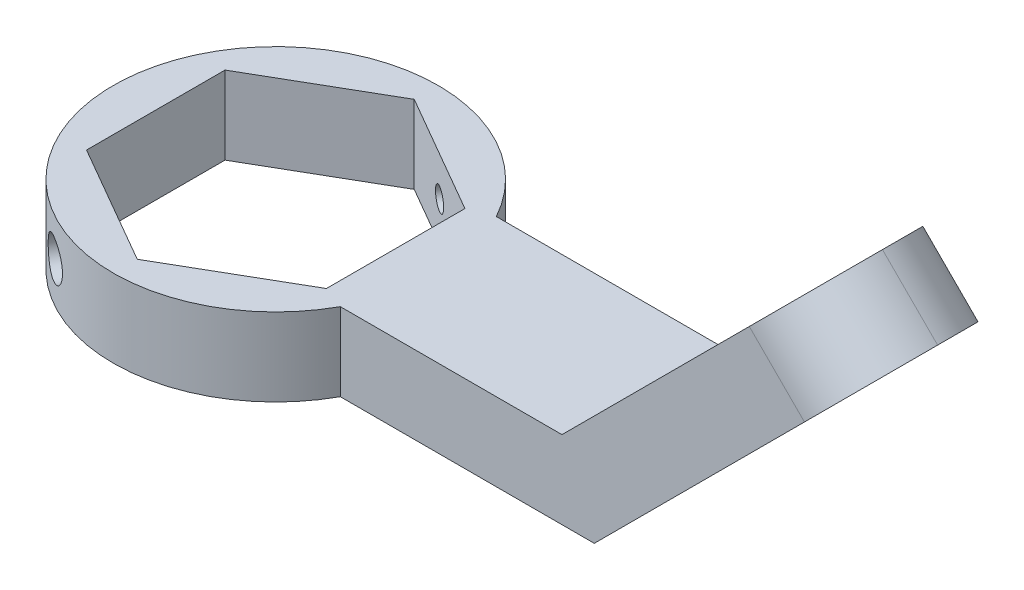
ISO-10303-21;
HEADER;
FILE_DESCRIPTION(('STEP AP214'),'2;1');
FILE_NAME('part.step','',(''),(''),'','','');
FILE_SCHEMA(('AUTOMOTIVE_DESIGN { 1 0 10303 214 1 1 1 1 }'));
ENDSEC;
DATA;
#1=APPLICATION_CONTEXT('core data for automotive mechanical design processes');
#2=APPLICATION_PROTOCOL_DEFINITION('international standard','automotive_design',2000,#1);
#3=PRODUCT_CONTEXT('',#1,'mechanical');
#4=PRODUCT('Part','Part','',(#3));
#5=PRODUCT_RELATED_PRODUCT_CATEGORY('part','',(#4));
#6=PRODUCT_DEFINITION_FORMATION('','',#4);
#7=PRODUCT_DEFINITION_CONTEXT('part definition',#1,'design');
#8=PRODUCT_DEFINITION('design','',#6,#7);
#9=PRODUCT_DEFINITION_SHAPE('','',#8);
#10=(LENGTH_UNIT() NAMED_UNIT(*) SI_UNIT(.MILLI.,.METRE.));
#11=(NAMED_UNIT(*) PLANE_ANGLE_UNIT() SI_UNIT($,.RADIAN.));
#12=(NAMED_UNIT(*) SI_UNIT($,.STERADIAN.) SOLID_ANGLE_UNIT());
#13=UNCERTAINTY_MEASURE_WITH_UNIT(LENGTH_MEASURE(1.E-05),#10,'distance_accuracy_value','');
#14=(GEOMETRIC_REPRESENTATION_CONTEXT(3) GLOBAL_UNCERTAINTY_ASSIGNED_CONTEXT((#13)) GLOBAL_UNIT_ASSIGNED_CONTEXT((#10,
#11,#12)) REPRESENTATION_CONTEXT('',''));
#15=CARTESIAN_POINT('',(0.,0.,0.));
#16=DIRECTION('',(0.,0.,1.));
#17=DIRECTION('',(1.,0.,0.));
#18=AXIS2_PLACEMENT_3D('',#15,#16,#17);
#19=CARTESIAN_POINT('',(0.,12.,0.));
#20=DIRECTION('',(0.,-1.,0.));
#21=DIRECTION('',(0.,0.,-1.));
#22=AXIS2_PLACEMENT_3D('',#19,#20,#21);
#23=CYLINDRICAL_SURFACE('',#22,25.);
#24=CARTESIAN_POINT('',(0.,0.,0.));
#25=DIRECTION('',(0.,1.,0.));
#26=DIRECTION('',(0.,0.,1.));
#27=AXIS2_PLACEMENT_3D('',#24,#25,#26);
#28=CIRCLE('',#27,25.);
#29=CARTESIAN_POINT('',(21.9317121994613,0.,-12.));
#30=VERTEX_POINT('',#29);
#31=CARTESIAN_POINT('',(21.9317121994613,0.,12.));
#32=VERTEX_POINT('',#31);
#33=EDGE_CURVE('E183',#30,#32,#28,.T.);
#34=ORIENTED_EDGE('',*,*,#33,.T.);
#35=DIRECTION('',(0.,-1.,0.));
#36=VECTOR('',#35,1.);
#37=CARTESIAN_POINT('',(21.9317121994613,12.,12.));
#38=LINE('',#37,#36);
#39=CARTESIAN_POINT('',(21.9317121994613,12.,12.));
#40=VERTEX_POINT('',#39);
#41=EDGE_CURVE('E237',#40,#32,#38,.T.);
#42=ORIENTED_EDGE('',*,*,#41,.F.);
#43=CARTESIAN_POINT('',(0.,12.,0.));
#44=DIRECTION('',(0.,1.,0.));
#45=DIRECTION('',(0.,0.,1.));
#46=AXIS2_PLACEMENT_3D('',#43,#44,#45);
#47=CIRCLE('',#46,25.);
#48=CARTESIAN_POINT('',(21.9317121994613,12.,-12.));
#49=VERTEX_POINT('',#48);
#50=EDGE_CURVE('E232',#49,#40,#47,.T.);
#51=ORIENTED_EDGE('',*,*,#50,.F.);
#52=DIRECTION('',(0.,-1.,0.));
#53=VECTOR('',#52,1.);
#54=CARTESIAN_POINT('',(21.9317121994613,12.,-12.));
#55=LINE('',#54,#53);
#56=EDGE_CURVE('E253',#49,#30,#55,.T.);
#57=ORIENTED_EDGE('',*,*,#56,.T.);
#58=EDGE_LOOP('',(#34,#42,#51,#57));
#59=FACE_BOUND('',#58,.T.);
#60=CARTESIAN_POINT('',(15.0077498573442,6.,-19.9941852602047));
#61=CARTESIAN_POINT('',(15.0077448122229,6.16785914119987,-19.9941908583441));
#62=CARTESIAN_POINT('',(14.9963684818543,6.33582452014984,-20.0027438696797));
#63=CARTESIAN_POINT('',(14.9510929308831,6.66708461205788,-20.0366062107909));
#64=CARTESIAN_POINT('',(14.9171698949131,6.83037419568626,-20.0619332583471));
#65=CARTESIAN_POINT('',(14.8276012887336,7.14743840550452,-20.1282220941398));
#66=CARTESIAN_POINT('',(14.77197011862,7.30121926113373,-20.1691735175431));
#67=CARTESIAN_POINT('',(14.6402729954507,7.59504714210346,-20.2649699136414));
#68=CARTESIAN_POINT('',(14.5642106581854,7.73509659156863,-20.3198124278732));
#69=CARTESIAN_POINT('',(14.3929912745472,7.9982397716095,-20.4414492818103));
#70=CARTESIAN_POINT('',(14.2977477518982,8.12125229434842,-20.5082975950783));
#71=CARTESIAN_POINT('',(14.0906106869445,8.34612871816209,-20.6511618907633));
#72=CARTESIAN_POINT('',(13.9787163315991,8.44799158594184,-20.7271783208143));
#73=CARTESIAN_POINT('',(13.7406151164317,8.62796653293622,-20.8857843719726));
#74=CARTESIAN_POINT('',(13.6143657512348,8.70600541573962,-20.9683932862663));
#75=CARTESIAN_POINT('',(13.3510419235556,8.83564846038475,-21.1370314110348));
#76=CARTESIAN_POINT('',(13.2139678328924,8.88725352974773,-21.2230605039794));
#77=CARTESIAN_POINT('',(12.9333396281705,8.96232225610345,-21.3952256335651));
#78=CARTESIAN_POINT('',(12.7898200164027,8.98592065344577,-21.4813591459841));
#79=CARTESIAN_POINT('',(12.4996812665472,9.00472359931052,-21.6514720254139));
#80=CARTESIAN_POINT('',(12.3530622415624,8.99992918215822,-21.7354514707834));
#81=CARTESIAN_POINT('',(12.0617107677518,8.96219087814864,-21.8984672109817));
#82=CARTESIAN_POINT('',(11.9169724943475,8.92939189502761,-21.9775267077472));
#83=CARTESIAN_POINT('',(11.6328643804115,8.83680184828401,-22.1292208846134));
#84=CARTESIAN_POINT('',(11.493494635164,8.77701030581835,-22.2018554507096));
#85=CARTESIAN_POINT('',(11.2239597214492,8.63197727109348,-22.3393307461755));
#86=CARTESIAN_POINT('',(11.0938183424583,8.54667276399358,-22.4041516136281));
#87=CARTESIAN_POINT('',(10.8470961575383,8.35308110104385,-22.524639499839));
#88=CARTESIAN_POINT('',(10.7305159252157,8.24479297358439,-22.5803061314344));
#89=CARTESIAN_POINT('',(10.5138724366611,8.00749565045954,-22.681995667056));
#90=CARTESIAN_POINT('',(10.413917856451,7.8783602186265,-22.7279556107894));
#91=CARTESIAN_POINT('',(10.2346680426288,7.6034684863205,-22.8092368849377));
#92=CARTESIAN_POINT('',(10.1553728649674,7.45771214083552,-22.8445581865404));
#93=CARTESIAN_POINT('',(10.0200722259647,7.15360750985263,-22.9042277580537));
#94=CARTESIAN_POINT('',(9.96407544232853,6.9952545587421,-22.9285719397152));
#95=CARTESIAN_POINT('',(9.87735658101705,6.67050764049883,-22.9660636434439));
#96=CARTESIAN_POINT('',(9.84663338382343,6.50411402988071,-22.9792116614571));
#97=CARTESIAN_POINT('',(9.81165736832351,6.16911690362332,-22.9941676426372));
#98=CARTESIAN_POINT('',(9.80724113542349,6.00053356411887,-22.9960456140484));
#99=CARTESIAN_POINT('',(9.82459827105967,5.66497121915707,-22.9886353305408));
#100=CARTESIAN_POINT('',(9.84637112616817,5.49799218231263,-22.9793472945274));
#101=CARTESIAN_POINT('',(9.91523042894637,5.17090421640203,-22.9497187105284));
#102=CARTESIAN_POINT('',(9.9622384504026,5.01077565319068,-22.9294124031923));
#103=CARTESIAN_POINT('',(10.0799047358108,4.70132071702404,-22.8779286737309));
#104=CARTESIAN_POINT('',(10.1505637687569,4.55199469549695,-22.846750898127));
#105=CARTESIAN_POINT('',(10.3135780379821,4.26758370502538,-22.7736272240438));
#106=CARTESIAN_POINT('',(10.4060373681187,4.1325717131187,-22.7316295698714));
#107=CARTESIAN_POINT('',(10.6094582562287,3.88136488698821,-22.6374010973035));
#108=CARTESIAN_POINT('',(10.7204204764659,3.76517072659412,-22.5851699126131));
#109=CARTESIAN_POINT('',(10.9579645431768,3.55428025276508,-22.4708798816559));
#110=CARTESIAN_POINT('',(11.0846251738425,3.45969975348858,-22.4087709827878));
#111=CARTESIAN_POINT('',(11.349145011588,3.29552179067091,-22.2759686413585));
#112=CARTESIAN_POINT('',(11.4870040081542,3.22592385762556,-22.2052753601593));
#113=CARTESIAN_POINT('',(11.7693367200859,3.1138789951242,-22.0569276600148));
#114=CARTESIAN_POINT('',(11.9137929980543,3.07136448011575,-21.9792911247827));
#115=CARTESIAN_POINT('',(12.2052999626119,3.01447325641784,-21.8187608268453));
#116=CARTESIAN_POINT('',(12.3523505415831,3.00009538330687,-21.7358672818454));
#117=CARTESIAN_POINT('',(12.6438178364023,2.99990615588767,-21.5676148817831));
#118=CARTESIAN_POINT('',(12.7882452936808,3.01391596331676,-21.4822747789911));
#119=CARTESIAN_POINT('',(13.0713715487918,3.06972645490249,-21.3111851975251));
#120=CARTESIAN_POINT('',(13.2100703485019,3.11152712994959,-21.2254357189854));
#121=CARTESIAN_POINT('',(13.477991001422,3.22167801513152,-21.0563260864519));
#122=CARTESIAN_POINT('',(13.6072156471211,3.29002036445423,-20.9729652328642));
#123=CARTESIAN_POINT('',(13.8529545520937,3.45129606958466,-20.811470298118));
#124=CARTESIAN_POINT('',(13.9694687084931,3.54422962440383,-20.7333362592653));
#125=CARTESIAN_POINT('',(14.1876278495494,3.75271368200529,-20.5846733058025));
#126=CARTESIAN_POINT('',(14.2891788082149,3.86839735532213,-20.5141931585145));
#127=CARTESIAN_POINT('',(14.4741902117345,4.11882303715606,-20.3840782308888));
#128=CARTESIAN_POINT('',(14.5576463553061,4.25356956451488,-20.3244460297358));
#129=CARTESIAN_POINT('',(14.7047669267929,4.53884293615902,-20.2182619360987));
#130=CARTESIAN_POINT('',(14.7683597317966,4.68942432822658,-20.1717574359622));
#131=CARTESIAN_POINT('',(14.873815071958,5.00161775370404,-20.0941272905822));
#132=CARTESIAN_POINT('',(14.9157014335021,5.16321747118554,-20.0629847848425));
#133=CARTESIAN_POINT('',(14.9667009867078,5.43805953911158,-20.0249463291909));
#134=CARTESIAN_POINT('',(14.9820764359216,5.54956275196226,-20.0134342910565));
#135=CARTESIAN_POINT('',(15.0026025348899,5.77402793213187,-19.998051898002));
#136=CARTESIAN_POINT('',(15.0077532539403,5.88698988955927,-19.9941814912925));
#137=CARTESIAN_POINT('',(15.0077498573442,6.,-19.9941852602047));
#138=B_SPLINE_CURVE_WITH_KNOTS('',3,(#60,#61,#62,#63,#64,#65,#66,#67,#68,#69,#70,#71,#72,#73,
#74,#75,#76,#77,#78,#79,#80,#81,#82,#83,#84,#85,#86,#87,#88,#89,#90,#91,#92,#93,#94,#95,#96,#97,
#98,#99,#100,#101,#102,#103,#104,#105,#106,#107,#108,#109,#110,#111,#112,#113,#114,#115,#116,
#117,#118,#119,#120,#121,#122,#123,#124,#125,#126,#127,#128,#129,#130,#131,#132,#133,#134,#135,
#136,#137),.UNSPECIFIED.,.T.,.F.,(4,2,2,2,2,2,2,2,2,2,2,2,2,2,2,2,2,2,2,2,2,2,2,2,2,2,2,2,2,2,2,
2,2,2,2,2,2,2,4),(0.,0.503164613232923,1.00686154966524,1.51022492507114,2.01349927674882,
2.51909553323416,3.02471648549882,3.53187561756201,4.03901733675556,4.54370917218766,
5.04838262225285,5.55046046161349,6.05254720809332,6.55588445357932,7.05924298138499,
7.56577244411506,8.07230327863779,8.57902260679249,9.08571948810824,9.58926554088957,
10.0928017219916,10.5947819896887,11.0967785804672,11.6012225031328,12.105684484956,
12.6127892929794,13.119884570345,13.6257094034364,14.1315133027652,14.6341406188081,
15.1367677700954,15.6392461723566,16.1417286411941,16.6472450412647,17.1528814752089,
17.6603206216507,18.1672015841626,18.5059562893408,18.8447086986815),.UNSPECIFIED.);
#139=CARTESIAN_POINT('',(15.0077498573442,6.,-19.9941852602047));
#140=VERTEX_POINT('',#139);
#141=EDGE_CURVE('E284',#140,#140,#138,.T.);
#142=ORIENTED_EDGE('',*,*,#141,.T.);
#143=EDGE_LOOP('',(#142));
#144=FACE_BOUND('',#143,.T.);
#145=CARTESIAN_POINT('',(-15.0077498573442,6.,19.9941852602047));
#146=CARTESIAN_POINT('',(-15.0077448122229,5.83214085880013,19.9941908583441));
#147=CARTESIAN_POINT('',(-14.9963684818543,5.66417547985016,20.0027438696797));
#148=CARTESIAN_POINT('',(-14.9510929308831,5.33291538794212,20.0366062107909));
#149=CARTESIAN_POINT('',(-14.9171698949131,5.16962580431374,20.0619332583471));
#150=CARTESIAN_POINT('',(-14.8276012887336,4.85256159449548,20.1282220941398));
#151=CARTESIAN_POINT('',(-14.77197011862,4.69878073886627,20.1691735175431));
#152=CARTESIAN_POINT('',(-14.6402729954507,4.40495285789654,20.2649699136414));
#153=CARTESIAN_POINT('',(-14.5642106581854,4.26490340843137,20.3198124278732));
#154=CARTESIAN_POINT('',(-14.3929912745472,4.0017602283905,20.4414492818103));
#155=CARTESIAN_POINT('',(-14.2977477518982,3.87874770565158,20.5082975950783));
#156=CARTESIAN_POINT('',(-14.0906106869445,3.65387128183791,20.6511618907633));
#157=CARTESIAN_POINT('',(-13.9787163315991,3.55200841405816,20.7271783208143));
#158=CARTESIAN_POINT('',(-13.7406151164317,3.37203346706378,20.8857843719726));
#159=CARTESIAN_POINT('',(-13.6143657512348,3.29399458426038,20.9683932862663));
#160=CARTESIAN_POINT('',(-13.3510419235556,3.16435153961525,21.1370314110348));
#161=CARTESIAN_POINT('',(-13.2139678328924,3.11274647025227,21.2230605039794));
#162=CARTESIAN_POINT('',(-12.9333396281705,3.03767774389655,21.3952256335651));
#163=CARTESIAN_POINT('',(-12.7898200164027,3.01407934655423,21.4813591459841));
#164=CARTESIAN_POINT('',(-12.4996812665472,2.99527640068948,21.6514720254138));
#165=CARTESIAN_POINT('',(-12.3530622415624,3.00007081784178,21.7354514707834));
#166=CARTESIAN_POINT('',(-12.0617107677518,3.03780912185136,21.8984672109817));
#167=CARTESIAN_POINT('',(-11.9169724943475,3.07060810497239,21.9775267077472));
#168=CARTESIAN_POINT('',(-11.6328643804115,3.163198151716,22.1292208846133));
#169=CARTESIAN_POINT('',(-11.493494635164,3.22298969418165,22.2018554507096));
#170=CARTESIAN_POINT('',(-11.2239597214492,3.36802272890653,22.3393307461755));
#171=CARTESIAN_POINT('',(-11.0938183424583,3.45332723600642,22.4041516136281));
#172=CARTESIAN_POINT('',(-10.8470961575383,3.64691889895615,22.524639499839));
#173=CARTESIAN_POINT('',(-10.7305159252157,3.75520702641561,22.5803061314344));
#174=CARTESIAN_POINT('',(-10.5138724366611,3.99250434954046,22.681995667056));
#175=CARTESIAN_POINT('',(-10.413917856451,4.1216397813735,22.7279556107894));
#176=CARTESIAN_POINT('',(-10.2346680426288,4.39653151367951,22.8092368849377));
#177=CARTESIAN_POINT('',(-10.1553728649674,4.54228785916448,22.8445581865404));
#178=CARTESIAN_POINT('',(-10.0200722259647,4.84639249014738,22.9042277580537));
#179=CARTESIAN_POINT('',(-9.96407544232853,5.00474544125791,22.9285719397152));
#180=CARTESIAN_POINT('',(-9.87735658101706,5.32949235950118,22.9660636434439));
#181=CARTESIAN_POINT('',(-9.84663338382344,5.4958859701193,22.9792116614571));
#182=CARTESIAN_POINT('',(-9.81165736832351,5.83088309637668,22.9941676426372));
#183=CARTESIAN_POINT('',(-9.80724113542349,5.99946643588113,22.9960456140484));
#184=CARTESIAN_POINT('',(-9.82459827105967,6.33502878084293,22.9886353305408));
#185=CARTESIAN_POINT('',(-9.84637112616817,6.50200781768738,22.9793472945274));
#186=CARTESIAN_POINT('',(-9.91523042894637,6.82909578359798,22.9497187105284));
#187=CARTESIAN_POINT('',(-9.96223845040261,6.98922434680932,22.9294124031923));
#188=CARTESIAN_POINT('',(-10.0799047358108,7.29867928297596,22.8779286737309));
#189=CARTESIAN_POINT('',(-10.1505637687569,7.44800530450305,22.846750898127));
#190=CARTESIAN_POINT('',(-10.3135780379821,7.73241629497462,22.7736272240438));
#191=CARTESIAN_POINT('',(-10.4060373681187,7.86742828688131,22.7316295698714));
#192=CARTESIAN_POINT('',(-10.6094582562288,8.11863511301179,22.6374010973034));
#193=CARTESIAN_POINT('',(-10.7204204764659,8.23482927340588,22.5851699126131));
#194=CARTESIAN_POINT('',(-10.9579645431768,8.44571974723492,22.4708798816559));
#195=CARTESIAN_POINT('',(-11.0846251738425,8.54030024651142,22.4087709827878));
#196=CARTESIAN_POINT('',(-11.349145011588,8.7044782093291,22.2759686413585));
#197=CARTESIAN_POINT('',(-11.4870040081543,8.77407614237444,22.2052753601593));
#198=CARTESIAN_POINT('',(-11.7693367200859,8.8861210048758,22.0569276600148));
#199=CARTESIAN_POINT('',(-11.9137929980543,8.92863551988425,21.9792911247827));
#200=CARTESIAN_POINT('',(-12.2052999626119,8.98552674358216,21.8187608268453));
#201=CARTESIAN_POINT('',(-12.3523505415831,8.99990461669313,21.7358672818454));
#202=CARTESIAN_POINT('',(-12.6438178364023,9.00009384411233,21.5676148817831));
#203=CARTESIAN_POINT('',(-12.7882452936809,8.98608403668324,21.4822747789911));
#204=CARTESIAN_POINT('',(-13.0713715487918,8.93027354509751,21.3111851975251));
#205=CARTESIAN_POINT('',(-13.2100703485019,8.88847287005041,21.2254357189854));
#206=CARTESIAN_POINT('',(-13.477991001422,8.77832198486848,21.0563260864519));
#207=CARTESIAN_POINT('',(-13.6072156471211,8.70997963554577,20.9729652328642));
#208=CARTESIAN_POINT('',(-13.8529545520937,8.54870393041534,20.811470298118));
#209=CARTESIAN_POINT('',(-13.9694687084931,8.45577037559617,20.7333362592653));
#210=CARTESIAN_POINT('',(-14.1876278495494,8.24728631799472,20.5846733058025));
#211=CARTESIAN_POINT('',(-14.2891788082149,8.13160264467787,20.5141931585145));
#212=CARTESIAN_POINT('',(-14.4741902117345,7.88117696284394,20.3840782308888));
#213=CARTESIAN_POINT('',(-14.5576463553061,7.74643043548511,20.3244460297358));
#214=CARTESIAN_POINT('',(-14.7047669267929,7.46115706384097,20.2182619360987));
#215=CARTESIAN_POINT('',(-14.7683597317966,7.31057567177342,20.1717574359622));
#216=CARTESIAN_POINT('',(-14.873815071958,6.99838224629595,20.0941272905821));
#217=CARTESIAN_POINT('',(-14.9157014335021,6.83678252881446,20.0629847848425));
#218=CARTESIAN_POINT('',(-14.9667009867078,6.56194046088842,20.0249463291909));
#219=CARTESIAN_POINT('',(-14.9820764359216,6.45043724803773,20.0134342910565));
#220=CARTESIAN_POINT('',(-15.00260253489,6.22597206786813,19.998051898002));
#221=CARTESIAN_POINT('',(-15.0077532539403,6.11301011044073,19.9941814912925));
#222=CARTESIAN_POINT('',(-15.0077498573442,6.,19.9941852602047));
#223=B_SPLINE_CURVE_WITH_KNOTS('',3,(#145,#146,#147,#148,#149,#150,#151,#152,#153,#154,#155,
#156,#157,#158,#159,#160,#161,#162,#163,#164,#165,#166,#167,#168,#169,#170,#171,#172,#173,#174,
#175,#176,#177,#178,#179,#180,#181,#182,#183,#184,#185,#186,#187,#188,#189,#190,#191,#192,#193,
#194,#195,#196,#197,#198,#199,#200,#201,#202,#203,#204,#205,#206,#207,#208,#209,#210,#211,#212,
#213,#214,#215,#216,#217,#218,#219,#220,#221,#222),.UNSPECIFIED.,.T.,.F.,(4,2,2,2,2,2,2,2,2,2,2,
2,2,2,2,2,2,2,2,2,2,2,2,2,2,2,2,2,2,2,2,2,2,2,2,2,2,2,4),(0.,0.503164613232922,1.00686154966524,
1.51022492507114,2.01349927674882,2.51909553323416,3.02471648549883,3.53187561756201,
4.03901733675556,4.54370917218765,5.04838262225285,5.55046046161349,6.05254720809332,
6.55588445357933,7.05924298138499,7.56577244411506,8.07230327863779,8.57902260679249,
9.08571948810824,9.58926554088957,10.0928017219916,10.5947819896887,11.0967785804672,
11.6012225031328,12.105684484956,12.6127892929794,13.119884570345,13.6257094034364,
14.1315133027652,14.6341406188081,15.1367677700954,15.6392461723566,16.1417286411941,
16.6472450412647,17.1528814752089,17.6603206216507,18.1672015841626,18.5059562893408,
18.8447086986815),.UNSPECIFIED.);
#224=CARTESIAN_POINT('',(-15.0077498573442,6.,19.9941852602047));
#225=VERTEX_POINT('',#224);
#226=EDGE_CURVE('E75',#225,#225,#223,.T.);
#227=ORIENTED_EDGE('',*,*,#226,.F.);
#228=EDGE_LOOP('',(#227));
#229=FACE_BOUND('',#228,.T.);
#230=ADVANCED_FACE('F71',(#59,#144,#229),#23,.T.);
#231=CARTESIAN_POINT('',(82.0147186257614,37.9852813742385,0.));
#232=DIRECTION('',(0.707106781186549,-0.707106781186546,0.));
#233=DIRECTION('',(0.707106781186546,0.707106781186549,0.));
#234=AXIS2_PLACEMENT_3D('',#231,#232,#233);
#235=CYLINDRICAL_SURFACE('',#234,4.);
#236=CARTESIAN_POINT('',(82.0147186257614,37.9852813742385,0.));
#237=DIRECTION('',(0.707106781186549,-0.707106781186546,0.));
#238=DIRECTION('',(0.707106781186546,0.707106781186549,0.));
#239=AXIS2_PLACEMENT_3D('',#236,#237,#238);
#240=CIRCLE('',#239,4.);
#241=CARTESIAN_POINT('',(84.8431457505076,40.8137084989847,0.));
#242=VERTEX_POINT('',#241);
#243=EDGE_CURVE('E198',#242,#242,#240,.T.);
#244=ORIENTED_EDGE('',*,*,#243,.F.);
#245=EDGE_LOOP('',(#244));
#246=FACE_BOUND('',#245,.T.);
#247=CARTESIAN_POINT('',(86.8584000768893,33.1415999231107,0.));
#248=DIRECTION('',(0.707106781186549,-0.707106781186546,0.));
#249=DIRECTION('',(0.707106781186546,0.707106781186549,0.));
#250=AXIS2_PLACEMENT_3D('',#247,#248,#249);
#251=CIRCLE('',#250,4.);
#252=CARTESIAN_POINT('',(89.6868272016355,35.9700270478569,0.));
#253=VERTEX_POINT('',#252);
#254=EDGE_CURVE('E278',#253,#253,#251,.T.);
#255=ORIENTED_EDGE('',*,*,#254,.T.);
#256=EDGE_LOOP('',(#255));
#257=FACE_BOUND('',#256,.T.);
#258=ADVANCED_FACE('F316',(#246,#257),#235,.F.);
#259=CARTESIAN_POINT('',(0.,12.,0.));
#260=DIRECTION('',(0.,1.,0.));
#261=DIRECTION('',(0.,0.,1.));
#262=AXIS2_PLACEMENT_3D('',#259,#260,#261);
#263=PLANE('',#262);
#264=DIRECTION('',(-0.866025403784439,0.,-0.5));
#265=VECTOR('',#264,1.);
#266=CARTESIAN_POINT('',(9.22499999999999,12.,-15.9781686998229));
#267=LINE('',#266,#265);
#268=CARTESIAN_POINT('',(18.45,12.,-10.6521124665486));
#269=VERTEX_POINT('',#268);
#270=CARTESIAN_POINT('',(0.,12.,-21.3042249330972));
#271=VERTEX_POINT('',#270);
#272=EDGE_CURVE('E426',#269,#271,#267,.T.);
#273=ORIENTED_EDGE('',*,*,#272,.F.);
#274=DIRECTION('',(0.,0.,-1.));
#275=VECTOR('',#274,1.);
#276=CARTESIAN_POINT('',(18.45,12.,0.));
#277=LINE('',#276,#275);
#278=CARTESIAN_POINT('',(18.45,12.,10.6521124665486));
#279=VERTEX_POINT('',#278);
#280=EDGE_CURVE('E430',#279,#269,#277,.T.);
#281=ORIENTED_EDGE('',*,*,#280,.F.);
#282=DIRECTION('',(0.866025403784439,0.,-0.5));
#283=VECTOR('',#282,1.);
#284=CARTESIAN_POINT('',(9.225,12.,15.9781686998229));
#285=LINE('',#284,#283);
#286=CARTESIAN_POINT('',(0.,12.,21.3042249330972));
#287=VERTEX_POINT('',#286);
#288=EDGE_CURVE('E434',#287,#279,#285,.T.);
#289=ORIENTED_EDGE('',*,*,#288,.F.);
#290=DIRECTION('',(0.866025403784439,0.,0.5));
#291=VECTOR('',#290,1.);
#292=CARTESIAN_POINT('',(-9.225,12.,15.9781686998229));
#293=LINE('',#292,#291);
#294=CARTESIAN_POINT('',(-18.45,12.,10.6521124665486));
#295=VERTEX_POINT('',#294);
#296=EDGE_CURVE('E438',#295,#287,#293,.T.);
#297=ORIENTED_EDGE('',*,*,#296,.F.);
#298=DIRECTION('',(0.,0.,1.));
#299=VECTOR('',#298,1.);
#300=CARTESIAN_POINT('',(-18.45,12.,0.));
#301=LINE('',#300,#299);
#302=CARTESIAN_POINT('',(-18.45,12.,-10.6521124665486));
#303=VERTEX_POINT('',#302);
#304=EDGE_CURVE('E442',#303,#295,#301,.T.);
#305=ORIENTED_EDGE('',*,*,#304,.F.);
#306=DIRECTION('',(-0.866025403784439,0.,0.5));
#307=VECTOR('',#306,1.);
#308=CARTESIAN_POINT('',(-9.225,12.,-15.9781686998229));
#309=LINE('',#308,#307);
#310=EDGE_CURVE('E256',#271,#303,#309,.T.);
#311=ORIENTED_EDGE('',*,*,#310,.F.);
#312=EDGE_LOOP('',(#273,#281,#289,#297,#305,#311));
#313=FACE_BOUND('',#312,.T.);
#314=DIRECTION('',(1.,0.,0.));
#315=VECTOR('',#314,1.);
#316=CARTESIAN_POINT('',(0.,12.,12.));
#317=LINE('',#316,#315);
#318=CARTESIAN_POINT('',(56.029437251523,12.,12.));
#319=VERTEX_POINT('',#318);
#320=EDGE_CURVE('E419',#40,#319,#317,.T.);
#321=ORIENTED_EDGE('',*,*,#320,.T.);
#322=DIRECTION('',(0.,0.,-1.));
#323=VECTOR('',#322,1.);
#324=CARTESIAN_POINT('',(56.029437251523,12.,0.));
#325=LINE('',#324,#323);
#326=CARTESIAN_POINT('',(56.029437251523,12.,-12.));
#327=VERTEX_POINT('',#326);
#328=EDGE_CURVE('E252',#319,#327,#325,.T.);
#329=ORIENTED_EDGE('',*,*,#328,.T.);
#330=DIRECTION('',(1.,0.,0.));
#331=VECTOR('',#330,1.);
#332=CARTESIAN_POINT('',(0.,12.,-12.));
#333=LINE('',#332,#331);
#334=EDGE_CURVE('E422',#49,#327,#333,.T.);
#335=ORIENTED_EDGE('',*,*,#334,.F.);
#336=ORIENTED_EDGE('',*,*,#50,.T.);
#337=EDGE_LOOP('',(#321,#329,#335,#336));
#338=FACE_BOUND('',#337,.T.);
#339=ADVANCED_FACE('F319',(#313,#338),#263,.T.);
#340=CARTESIAN_POINT('',(9.22499999999999,12.,-15.9781686998229));
#341=DIRECTION('',(-0.5,0.,0.866025403784439));
#342=DIRECTION('',(0.866025403784439,0.,0.5));
#343=AXIS2_PLACEMENT_3D('',#340,#341,#342);
#344=PLANE('',#343);
#345=CARTESIAN_POINT('',(9.225,6.,-15.9781686998229));
#346=DIRECTION('',(-0.5,0.,0.866025403784439));
#347=DIRECTION('',(0.866025403784439,0.,0.5));
#348=AXIS2_PLACEMENT_3D('',#345,#346,#347);
#349=CIRCLE('',#348,1.7);
#350=CARTESIAN_POINT('',(10.6972431864335,6.,-15.1281686998229));
#351=VERTEX_POINT('',#350);
#352=EDGE_CURVE('E279',#351,#351,#349,.T.);
#353=ORIENTED_EDGE('',*,*,#352,.F.);
#354=EDGE_LOOP('',(#353));
#355=FACE_BOUND('',#354,.T.);
#356=DIRECTION('',(-0.866025403784439,0.,-0.5));
#357=VECTOR('',#356,1.);
#358=CARTESIAN_POINT('',(9.22499999999999,0.,-15.9781686998229));
#359=LINE('',#358,#357);
#360=CARTESIAN_POINT('',(18.45,0.,-10.6521124665486));
#361=VERTEX_POINT('',#360);
#362=CARTESIAN_POINT('',(0.,0.,-21.3042249330972));
#363=VERTEX_POINT('',#362);
#364=EDGE_CURVE('E186',#361,#363,#359,.T.);
#365=ORIENTED_EDGE('',*,*,#364,.F.);
#366=DIRECTION('',(0.,-1.,0.));
#367=VECTOR('',#366,1.);
#368=CARTESIAN_POINT('',(18.45,12.,-10.6521124665486));
#369=LINE('',#368,#367);
#370=EDGE_CURVE('E249',#269,#361,#369,.T.);
#371=ORIENTED_EDGE('',*,*,#370,.F.);
#372=ORIENTED_EDGE('',*,*,#272,.T.);
#373=DIRECTION('',(0.,-1.,0.));
#374=VECTOR('',#373,1.);
#375=CARTESIAN_POINT('',(0.,12.,-21.3042249330972));
#376=LINE('',#375,#374);
#377=EDGE_CURVE('E233',#271,#363,#376,.T.);
#378=ORIENTED_EDGE('',*,*,#377,.T.);
#379=EDGE_LOOP('',(#365,#371,#372,#378));
#380=FACE_BOUND('',#379,.T.);
#381=ADVANCED_FACE('F329',(#355,#380),#344,.T.);
#382=CARTESIAN_POINT('',(18.45,12.,0.));
#383=DIRECTION('',(-1.,0.,0.));
#384=DIRECTION('',(0.,0.,1.));
#385=AXIS2_PLACEMENT_3D('',#382,#383,#384);
#386=PLANE('',#385);
#387=DIRECTION('',(0.,0.,-1.));
#388=VECTOR('',#387,1.);
#389=CARTESIAN_POINT('',(18.45,0.,0.));
#390=LINE('',#389,#388);
#391=CARTESIAN_POINT('',(18.45,0.,10.6521124665486));
#392=VERTEX_POINT('',#391);
#393=EDGE_CURVE('E212',#392,#361,#390,.T.);
#394=ORIENTED_EDGE('',*,*,#393,.F.);
#395=DIRECTION('',(0.,-1.,0.));
#396=VECTOR('',#395,1.);
#397=CARTESIAN_POINT('',(18.45,12.,10.6521124665486));
#398=LINE('',#397,#396);
#399=EDGE_CURVE('E246',#279,#392,#398,.T.);
#400=ORIENTED_EDGE('',*,*,#399,.F.);
#401=ORIENTED_EDGE('',*,*,#280,.T.);
#402=ORIENTED_EDGE('',*,*,#370,.T.);
#403=EDGE_LOOP('',(#394,#400,#401,#402));
#404=FACE_BOUND('',#403,.T.);
#405=ADVANCED_FACE('F349',(#404),#386,.T.);
#406=CARTESIAN_POINT('',(9.225,12.,15.9781686998229));
#407=DIRECTION('',(-0.5,0.,-0.866025403784439));
#408=DIRECTION('',(-0.866025403784439,0.,0.5));
#409=AXIS2_PLACEMENT_3D('',#406,#407,#408);
#410=PLANE('',#409);
#411=DIRECTION('',(0.866025403784439,0.,-0.5));
#412=VECTOR('',#411,1.);
#413=CARTESIAN_POINT('',(9.225,0.,15.9781686998229));
#414=LINE('',#413,#412);
#415=CARTESIAN_POINT('',(0.,0.,21.3042249330972));
#416=VERTEX_POINT('',#415);
#417=EDGE_CURVE('E216',#416,#392,#414,.T.);
#418=ORIENTED_EDGE('',*,*,#417,.F.);
#419=DIRECTION('',(0.,-1.,0.));
#420=VECTOR('',#419,1.);
#421=CARTESIAN_POINT('',(0.,12.,21.3042249330972));
#422=LINE('',#421,#420);
#423=EDGE_CURVE('E243',#287,#416,#422,.T.);
#424=ORIENTED_EDGE('',*,*,#423,.F.);
#425=ORIENTED_EDGE('',*,*,#288,.T.);
#426=ORIENTED_EDGE('',*,*,#399,.T.);
#427=EDGE_LOOP('',(#418,#424,#425,#426));
#428=FACE_BOUND('',#427,.T.);
#429=ADVANCED_FACE('F345',(#428),#410,.T.);
#430=CARTESIAN_POINT('',(-9.225,12.,15.9781686998229));
#431=DIRECTION('',(0.5,0.,-0.866025403784439));
#432=DIRECTION('',(-0.866025403784439,0.,-0.5));
#433=AXIS2_PLACEMENT_3D('',#430,#431,#432);
#434=PLANE('',#433);
#435=CARTESIAN_POINT('',(-9.225,6.,15.9781686998229));
#436=DIRECTION('',(-0.5,0.,0.866025403784439));
#437=DIRECTION('',(0.866025403784439,0.,0.5));
#438=AXIS2_PLACEMENT_3D('',#435,#436,#437);
#439=CIRCLE('',#438,1.7);
#440=CARTESIAN_POINT('',(-7.75275681356646,6.,16.8281686998229));
#441=VERTEX_POINT('',#440);
#442=EDGE_CURVE('E373',#441,#441,#439,.T.);
#443=ORIENTED_EDGE('',*,*,#442,.T.);
#444=EDGE_LOOP('',(#443));
#445=FACE_BOUND('',#444,.T.);
#446=DIRECTION('',(0.866025403784439,0.,0.5));
#447=VECTOR('',#446,1.);
#448=CARTESIAN_POINT('',(-9.225,0.,15.9781686998229));
#449=LINE('',#448,#447);
#450=CARTESIAN_POINT('',(-18.45,0.,10.6521124665486));
#451=VERTEX_POINT('',#450);
#452=EDGE_CURVE('E220',#451,#416,#449,.T.);
#453=ORIENTED_EDGE('',*,*,#452,.F.);
#454=DIRECTION('',(0.,-1.,0.));
#455=VECTOR('',#454,1.);
#456=CARTESIAN_POINT('',(-18.45,12.,10.6521124665486));
#457=LINE('',#456,#455);
#458=EDGE_CURVE('E240',#295,#451,#457,.T.);
#459=ORIENTED_EDGE('',*,*,#458,.F.);
#460=ORIENTED_EDGE('',*,*,#296,.T.);
#461=ORIENTED_EDGE('',*,*,#423,.T.);
#462=EDGE_LOOP('',(#453,#459,#460,#461));
#463=FACE_BOUND('',#462,.T.);
#464=ADVANCED_FACE('F341',(#445,#463),#434,.T.);
#465=CARTESIAN_POINT('',(-18.45,12.,0.));
#466=DIRECTION('',(1.,0.,0.));
#467=DIRECTION('',(0.,0.,-1.));
#468=AXIS2_PLACEMENT_3D('',#465,#466,#467);
#469=PLANE('',#468);
#470=DIRECTION('',(0.,0.,1.));
#471=VECTOR('',#470,1.);
#472=CARTESIAN_POINT('',(-18.45,0.,0.));
#473=LINE('',#472,#471);
#474=CARTESIAN_POINT('',(-18.45,0.,-10.6521124665486));
#475=VERTEX_POINT('',#474);
#476=EDGE_CURVE('E224',#475,#451,#473,.T.);
#477=ORIENTED_EDGE('',*,*,#476,.F.);
#478=DIRECTION('',(0.,-1.,0.));
#479=VECTOR('',#478,1.);
#480=CARTESIAN_POINT('',(-18.45,12.,-10.6521124665486));
#481=LINE('',#480,#479);
#482=EDGE_CURVE('E236',#303,#475,#481,.T.);
#483=ORIENTED_EDGE('',*,*,#482,.F.);
#484=ORIENTED_EDGE('',*,*,#304,.T.);
#485=ORIENTED_EDGE('',*,*,#458,.T.);
#486=EDGE_LOOP('',(#477,#483,#484,#485));
#487=FACE_BOUND('',#486,.T.);
#488=ADVANCED_FACE('F337',(#487),#469,.T.);
#489=CARTESIAN_POINT('',(0.,12.,12.));
#490=DIRECTION('',(0.,0.,-1.));
#491=DIRECTION('',(-1.,0.,0.));
#492=AXIS2_PLACEMENT_3D('',#489,#490,#491);
#493=PLANE('',#492);
#494=DIRECTION('',(0.707106781186546,0.707106781186549,0.));
#495=VECTOR('',#494,1.);
#496=CARTESIAN_POINT('',(61.0000000000001,0.,12.));
#497=LINE('',#496,#495);
#498=CARTESIAN_POINT('',(61.0000000000001,0.,12.));
#499=VERTEX_POINT('',#498);
#500=CARTESIAN_POINT('',(93.3284271247462,32.3284271247461,12.));
#501=VERTEX_POINT('',#500);
#502=EDGE_CURVE('E197',#499,#501,#497,.T.);
#503=ORIENTED_EDGE('',*,*,#502,.T.);
#504=DIRECTION('',(0.707106781186549,-0.707106781186546,0.));
#505=VECTOR('',#504,1.);
#506=CARTESIAN_POINT('',(56.828427124746,68.8284271247462,12.));
#507=LINE('',#506,#505);
#508=CARTESIAN_POINT('',(84.8431457505076,40.8137084989847,12.));
#509=VERTEX_POINT('',#508);
#510=EDGE_CURVE('E12',#501,#509,#507,.F.);
#511=ORIENTED_EDGE('',*,*,#510,.T.);
#512=DIRECTION('',(0.707106781186546,0.707106781186549,0.));
#513=VECTOR('',#512,1.);
#514=CARTESIAN_POINT('',(52.5147186257615,8.48528137423854,12.));
#515=LINE('',#514,#513);
#516=EDGE_CURVE('E411',#319,#509,#515,.T.);
#517=ORIENTED_EDGE('',*,*,#516,.F.);
#518=ORIENTED_EDGE('',*,*,#320,.F.);
#519=ORIENTED_EDGE('',*,*,#41,.T.);
#520=DIRECTION('',(1.,0.,0.));
#521=VECTOR('',#520,1.);
#522=CARTESIAN_POINT('',(0.,0.,12.));
#523=LINE('',#522,#521);
#524=EDGE_CURVE('E202',#32,#499,#523,.T.);
#525=ORIENTED_EDGE('',*,*,#524,.T.);
#526=EDGE_LOOP('',(#503,#511,#517,#518,#519,#525));
#527=FACE_BOUND('',#526,.T.);
#528=ADVANCED_FACE('F340',(#527),#493,.F.);
#529=CARTESIAN_POINT('',(0.,12.,-12.));
#530=DIRECTION('',(0.,0.,-1.));
#531=DIRECTION('',(-1.,0.,0.));
#532=AXIS2_PLACEMENT_3D('',#529,#530,#531);
#533=PLANE('',#532);
#534=DIRECTION('',(0.707106781186546,0.707106781186549,0.));
#535=VECTOR('',#534,1.);
#536=CARTESIAN_POINT('',(52.5147186257615,8.48528137423855,-12.));
#537=LINE('',#536,#535);
#538=CARTESIAN_POINT('',(84.8431457505076,40.8137084989847,-12.));
#539=VERTEX_POINT('',#538);
#540=EDGE_CURVE('E408',#327,#539,#537,.T.);
#541=ORIENTED_EDGE('',*,*,#540,.T.);
#542=DIRECTION('',(0.707106781186549,-0.707106781186546,0.));
#543=VECTOR('',#542,1.);
#544=CARTESIAN_POINT('',(93.3284271247462,32.3284271247461,-12.));
#545=LINE('',#544,#543);
#546=CARTESIAN_POINT('',(93.3284271247462,32.3284271247462,-12.));
#547=VERTEX_POINT('',#546);
#548=EDGE_CURVE('E194',#539,#547,#545,.T.);
#549=ORIENTED_EDGE('',*,*,#548,.T.);
#550=DIRECTION('',(0.707106781186546,0.707106781186549,0.));
#551=VECTOR('',#550,1.);
#552=CARTESIAN_POINT('',(61.0000000000001,0.,-12.));
#553=LINE('',#552,#551);
#554=CARTESIAN_POINT('',(61.0000000000001,0.,-12.));
#555=VERTEX_POINT('',#554);
#556=EDGE_CURVE('E190',#555,#547,#553,.T.);
#557=ORIENTED_EDGE('',*,*,#556,.F.);
#558=DIRECTION('',(1.,0.,0.));
#559=VECTOR('',#558,1.);
#560=CARTESIAN_POINT('',(0.,0.,-12.));
#561=LINE('',#560,#559);
#562=EDGE_CURVE('E175',#30,#555,#561,.T.);
#563=ORIENTED_EDGE('',*,*,#562,.F.);
#564=ORIENTED_EDGE('',*,*,#56,.F.);
#565=ORIENTED_EDGE('',*,*,#334,.T.);
#566=EDGE_LOOP('',(#541,#549,#557,#563,#564,#565));
#567=FACE_BOUND('',#566,.T.);
#568=ADVANCED_FACE('F192',(#567),#533,.T.);
#569=CARTESIAN_POINT('',(-9.225,12.,-15.9781686998229));
#570=DIRECTION('',(0.5,0.,0.866025403784438));
#571=DIRECTION('',(0.866025403784439,0.,-0.5));
#572=AXIS2_PLACEMENT_3D('',#569,#570,#571);
#573=PLANE('',#572);
#574=DIRECTION('',(-0.866025403784439,0.,0.5));
#575=VECTOR('',#574,1.);
#576=CARTESIAN_POINT('',(-9.225,0.,-15.9781686998229));
#577=LINE('',#576,#575);
#578=EDGE_CURVE('E228',#363,#475,#577,.T.);
#579=ORIENTED_EDGE('',*,*,#578,.F.);
#580=ORIENTED_EDGE('',*,*,#377,.F.);
#581=ORIENTED_EDGE('',*,*,#310,.T.);
#582=ORIENTED_EDGE('',*,*,#482,.T.);
#583=EDGE_LOOP('',(#579,#580,#581,#582));
#584=FACE_BOUND('',#583,.T.);
#585=ADVANCED_FACE('F333',(#584),#573,.T.);
#586=CARTESIAN_POINT('',(0.,0.,0.));
#587=DIRECTION('',(0.,1.,0.));
#588=DIRECTION('',(0.,0.,1.));
#589=AXIS2_PLACEMENT_3D('',#586,#587,#588);
#590=PLANE('',#589);
#591=ORIENTED_EDGE('',*,*,#33,.F.);
#592=ORIENTED_EDGE('',*,*,#562,.T.);
#593=DIRECTION('',(0.,0.,-1.));
#594=VECTOR('',#593,1.);
#595=CARTESIAN_POINT('',(61.0000000000001,0.,0.));
#596=LINE('',#595,#594);
#597=EDGE_CURVE('E180',#499,#555,#596,.T.);
#598=ORIENTED_EDGE('',*,*,#597,.F.);
#599=ORIENTED_EDGE('',*,*,#524,.F.);
#600=EDGE_LOOP('',(#591,#592,#598,#599));
#601=FACE_BOUND('',#600,.T.);
#602=ORIENTED_EDGE('',*,*,#364,.T.);
#603=ORIENTED_EDGE('',*,*,#578,.T.);
#604=ORIENTED_EDGE('',*,*,#476,.T.);
#605=ORIENTED_EDGE('',*,*,#452,.T.);
#606=ORIENTED_EDGE('',*,*,#417,.T.);
#607=ORIENTED_EDGE('',*,*,#393,.T.);
#608=EDGE_LOOP('',(#602,#603,#604,#605,#606,#607));
#609=FACE_BOUND('',#608,.T.);
#610=ADVANCED_FACE('F177',(#601,#609),#590,.F.);
#611=CARTESIAN_POINT('',(22.0147186257616,-22.0147186257615,0.));
#612=DIRECTION('',(0.707106781186549,-0.707106781186546,0.));
#613=DIRECTION('',(0.707106781186546,0.707106781186549,0.));
#614=AXIS2_PLACEMENT_3D('',#611,#612,#613);
#615=PLANE('',#614);
#616=CARTESIAN_POINT('',(84.8431457505076,40.8137084989847,0.));
#617=DIRECTION('',(0.707106781186549,-0.707106781186546,0.));
#618=DIRECTION('',(0.707106781186546,0.707106781186549,0.));
#619=AXIS2_PLACEMENT_3D('',#616,#617,#618);
#620=CIRCLE('',#619,12.);
#621=CARTESIAN_POINT('',(93.3284271247461,49.2989898732233,0.));
#622=VERTEX_POINT('',#621);
#623=EDGE_CURVE('E94',#509,#622,#620,.F.);
#624=ORIENTED_EDGE('',*,*,#623,.T.);
#625=CARTESIAN_POINT('',(84.8431457505076,40.8137084989847,0.));
#626=DIRECTION('',(0.707106781186549,-0.707106781186546,0.));
#627=DIRECTION('',(0.707106781186546,0.707106781186549,0.));
#628=AXIS2_PLACEMENT_3D('',#625,#626,#627);
#629=CIRCLE('',#628,12.);
#630=EDGE_CURVE('E86',#622,#539,#629,.F.);
#631=ORIENTED_EDGE('',*,*,#630,.T.);
#632=ORIENTED_EDGE('',*,*,#540,.F.);
#633=ORIENTED_EDGE('',*,*,#328,.F.);
#634=ORIENTED_EDGE('',*,*,#516,.T.);
#635=EDGE_LOOP('',(#624,#631,#632,#633,#634));
#636=FACE_BOUND('',#635,.T.);
#637=ORIENTED_EDGE('',*,*,#243,.T.);
#638=EDGE_LOOP('',(#637));
#639=FACE_BOUND('',#638,.T.);
#640=ADVANCED_FACE('F321',(#636,#639),#615,.F.);
#641=CARTESIAN_POINT('',(30.5000000000002,-30.5000000000001,0.));
#642=DIRECTION('',(0.707106781186549,-0.707106781186546,0.));
#643=DIRECTION('',(0.707106781186546,0.707106781186549,0.));
#644=AXIS2_PLACEMENT_3D('',#641,#642,#643);
#645=PLANE('',#644);
#646=CARTESIAN_POINT('',(90.5,29.5,0.));
#647=DIRECTION('',(0.707106781186549,-0.707106781186546,0.));
#648=DIRECTION('',(0.707106781186546,0.707106781186549,0.));
#649=AXIS2_PLACEMENT_3D('',#646,#647,#648);
#650=CIRCLE('',#649,7.99999999999999);
#651=CARTESIAN_POINT('',(96.1568542494923,35.1568542494924,0.));
#652=VERTEX_POINT('',#651);
#653=EDGE_CURVE('E397',#652,#652,#650,.T.);
#654=ORIENTED_EDGE('',*,*,#653,.F.);
#655=EDGE_LOOP('',(#654));
#656=FACE_BOUND('',#655,.T.);
#657=ORIENTED_EDGE('',*,*,#556,.T.);
#658=CARTESIAN_POINT('',(93.3284271247462,32.3284271247461,0.));
#659=DIRECTION('',(0.707106781186549,-0.707106781186546,0.));
#660=DIRECTION('',(0.707106781186546,0.707106781186549,0.));
#661=AXIS2_PLACEMENT_3D('',#658,#659,#660);
#662=CIRCLE('',#661,12.);
#663=CARTESIAN_POINT('',(101.813708498985,40.8137084989847,0.));
#664=VERTEX_POINT('',#663);
#665=EDGE_CURVE('E267',#547,#664,#662,.T.);
#666=ORIENTED_EDGE('',*,*,#665,.T.);
#667=CARTESIAN_POINT('',(93.3284271247462,32.3284271247462,0.));
#668=DIRECTION('',(0.707106781186549,-0.707106781186546,0.));
#669=DIRECTION('',(0.707106781186546,0.707106781186549,0.));
#670=AXIS2_PLACEMENT_3D('',#667,#668,#669);
#671=CIRCLE('',#670,12.);
#672=EDGE_CURVE('E264',#664,#501,#671,.T.);
#673=ORIENTED_EDGE('',*,*,#672,.T.);
#674=ORIENTED_EDGE('',*,*,#502,.F.);
#675=ORIENTED_EDGE('',*,*,#597,.T.);
#676=EDGE_LOOP('',(#657,#666,#673,#674,#675));
#677=FACE_BOUND('',#676,.T.);
#678=ADVANCED_FACE('F200',(#656,#677),#645,.T.);
#679=CARTESIAN_POINT('',(86.8584000768893,33.1415999231107,0.));
#680=DIRECTION('',(0.707106781186549,-0.707106781186546,0.));
#681=DIRECTION('',(0.707106781186546,0.707106781186549,0.));
#682=AXIS2_PLACEMENT_3D('',#679,#680,#681);
#683=CYLINDRICAL_SURFACE('',#682,7.99999999999999);
#684=CARTESIAN_POINT('',(86.8584000768893,33.1415999231107,0.));
#685=DIRECTION('',(0.707106781186549,-0.707106781186546,0.));
#686=DIRECTION('',(0.707106781186546,0.707106781186549,0.));
#687=AXIS2_PLACEMENT_3D('',#684,#685,#686);
#688=CIRCLE('',#687,7.99999999999999);
#689=CARTESIAN_POINT('',(92.5152543263816,38.7984541726031,0.));
#690=VERTEX_POINT('',#689);
#691=EDGE_CURVE('E398',#690,#690,#688,.T.);
#692=ORIENTED_EDGE('',*,*,#691,.F.);
#693=EDGE_LOOP('',(#692));
#694=FACE_BOUND('',#693,.T.);
#695=ORIENTED_EDGE('',*,*,#653,.T.);
#696=EDGE_LOOP('',(#695));
#697=FACE_BOUND('',#696,.T.);
#698=ADVANCED_FACE('F311',(#694,#697),#683,.F.);
#699=CARTESIAN_POINT('',(86.8584000768893,33.1415999231107,0.));
#700=DIRECTION('',(0.707106781186549,-0.707106781186546,0.));
#701=DIRECTION('',(0.707106781186546,0.707106781186549,0.));
#702=AXIS2_PLACEMENT_3D('',#699,#700,#701);
#703=PLANE('',#702);
#704=ORIENTED_EDGE('',*,*,#254,.F.);
#705=EDGE_LOOP('',(#704));
#706=FACE_BOUND('',#705,.T.);
#707=ORIENTED_EDGE('',*,*,#691,.T.);
#708=EDGE_LOOP('',(#707));
#709=FACE_BOUND('',#708,.T.);
#710=ADVANCED_FACE('F308',(#706,#709),#703,.T.);
#711=CARTESIAN_POINT('',(84.8431457505076,40.8137084989847,0.));
#712=DIRECTION('',(0.707106781186549,-0.707106781186546,0.));
#713=DIRECTION('',(0.707106781186546,0.707106781186549,0.));
#714=AXIS2_PLACEMENT_3D('',#711,#712,#713);
#715=CYLINDRICAL_SURFACE('',#714,12.);
#716=DIRECTION('',(0.707106781186549,-0.707106781186546,0.));
#717=VECTOR('',#716,1.);
#718=CARTESIAN_POINT('',(93.3284271247461,49.2989898732233,0.));
#719=LINE('',#718,#717);
#720=EDGE_CURVE('E274',#622,#664,#719,.T.);
#721=ORIENTED_EDGE('',*,*,#720,.F.);
#722=ORIENTED_EDGE('',*,*,#623,.F.);
#723=ORIENTED_EDGE('',*,*,#510,.F.);
#724=ORIENTED_EDGE('',*,*,#672,.F.);
#725=EDGE_LOOP('',(#721,#722,#723,#724));
#726=FACE_BOUND('',#725,.T.);
#727=ADVANCED_FACE('F73',(#726),#715,.T.);
#728=CARTESIAN_POINT('',(56.828427124746,68.8284271247462,0.));
#729=DIRECTION('',(-0.707106781186549,0.707106781186546,0.));
#730=DIRECTION('',(-0.707106781186546,-0.707106781186549,0.));
#731=AXIS2_PLACEMENT_3D('',#728,#729,#730);
#732=CYLINDRICAL_SURFACE('',#731,12.);
#733=ORIENTED_EDGE('',*,*,#630,.F.);
#734=ORIENTED_EDGE('',*,*,#720,.T.);
#735=ORIENTED_EDGE('',*,*,#665,.F.);
#736=ORIENTED_EDGE('',*,*,#548,.F.);
#737=EDGE_LOOP('',(#733,#734,#735,#736));
#738=FACE_BOUND('',#737,.T.);
#739=ADVANCED_FACE('F306',(#738),#732,.T.);
#740=CARTESIAN_POINT('',(36.2787446720516,6.,-62.8366290068122));
#741=DIRECTION('',(-0.5,0.,0.866025403784439));
#742=DIRECTION('',(0.866025403784439,0.,0.5));
#743=AXIS2_PLACEMENT_3D('',#740,#741,#742);
#744=CYLINDRICAL_SURFACE('',#743,1.7);
#745=CARTESIAN_POINT('',(11.725,6.,-20.3082957187451));
#746=DIRECTION('',(-0.5,0.,0.866025403784439));
#747=DIRECTION('',(0.866025403784439,0.,0.5));
#748=AXIS2_PLACEMENT_3D('',#745,#746,#747);
#749=CIRCLE('',#748,1.7);
#750=CARTESIAN_POINT('',(13.1972431864335,6.,-19.4582957187451));
#751=VERTEX_POINT('',#750);
#752=EDGE_CURVE('E280',#751,#751,#749,.F.);
#753=ORIENTED_EDGE('',*,*,#752,.T.);
#754=EDGE_LOOP('',(#753));
#755=FACE_BOUND('',#754,.T.);
#756=ORIENTED_EDGE('',*,*,#352,.T.);
#757=EDGE_LOOP('',(#756));
#758=FACE_BOUND('',#757,.T.);
#759=ADVANCED_FACE('F301',(#755,#758),#744,.F.);
#760=CARTESIAN_POINT('',(36.2787446720516,6.,-62.8366290068122));
#761=DIRECTION('',(-0.5,0.,0.866025403784439));
#762=DIRECTION('',(0.866025403784439,0.,0.5));
#763=AXIS2_PLACEMENT_3D('',#760,#761,#762);
#764=CYLINDRICAL_SURFACE('',#763,3.);
#765=CARTESIAN_POINT('',(11.725,6.,-20.3082957187451));
#766=DIRECTION('',(-0.5,0.,0.866025403784439));
#767=DIRECTION('',(0.866025403784439,0.,0.5));
#768=AXIS2_PLACEMENT_3D('',#765,#766,#767);
#769=CIRCLE('',#768,3.);
#770=CARTESIAN_POINT('',(14.3230762113533,6.,-18.8082957187451));
#771=VERTEX_POINT('',#770);
#772=EDGE_CURVE('E285',#771,#771,#769,.T.);
#773=ORIENTED_EDGE('',*,*,#772,.T.);
#774=EDGE_LOOP('',(#773));
#775=FACE_BOUND('',#774,.T.);
#776=ORIENTED_EDGE('',*,*,#141,.F.);
#777=EDGE_LOOP('',(#776));
#778=FACE_BOUND('',#777,.T.);
#779=ADVANCED_FACE('F295',(#775,#778),#764,.F.);
#780=CARTESIAN_POINT('',(11.725,6.,-20.3082957187451));
#781=DIRECTION('',(-0.5,0.,0.866025403784439));
#782=DIRECTION('',(0.866025403784439,0.,0.5));
#783=AXIS2_PLACEMENT_3D('',#780,#781,#782);
#784=PLANE('',#783);
#785=ORIENTED_EDGE('',*,*,#772,.F.);
#786=EDGE_LOOP('',(#785));
#787=FACE_BOUND('',#786,.T.);
#788=ORIENTED_EDGE('',*,*,#752,.F.);
#789=EDGE_LOOP('',(#788));
#790=FACE_BOUND('',#789,.T.);
#791=ADVANCED_FACE('F300',(#787,#790),#784,.F.);
#792=CARTESIAN_POINT('',(-17.0753175473055,6.,29.5753175473055));
#793=DIRECTION('',(0.5,0.,-0.866025403784439));
#794=DIRECTION('',(-0.866025403784439,0.,-0.5));
#795=AXIS2_PLACEMENT_3D('',#792,#793,#794);
#796=CYLINDRICAL_SURFACE('',#795,1.7);
#797=CARTESIAN_POINT('',(-11.725,6.,20.3082957187451));
#798=DIRECTION('',(0.5,0.,-0.866025403784439));
#799=DIRECTION('',(-0.866025403784439,0.,-0.5));
#800=AXIS2_PLACEMENT_3D('',#797,#798,#799);
#801=CIRCLE('',#800,1.7);
#802=CARTESIAN_POINT('',(-13.1972431864335,6.,19.4582957187451));
#803=VERTEX_POINT('',#802);
#804=EDGE_CURVE('E292',#803,#803,#801,.T.);
#805=ORIENTED_EDGE('',*,*,#804,.F.);
#806=EDGE_LOOP('',(#805));
#807=FACE_BOUND('',#806,.T.);
#808=ORIENTED_EDGE('',*,*,#442,.F.);
#809=EDGE_LOOP('',(#808));
#810=FACE_BOUND('',#809,.T.);
#811=ADVANCED_FACE('F530',(#807,#810),#796,.F.);
#812=CARTESIAN_POINT('',(-17.0753175473055,6.,29.5753175473055));
#813=DIRECTION('',(0.5,0.,-0.866025403784439));
#814=DIRECTION('',(-0.866025403784439,0.,-0.5));
#815=AXIS2_PLACEMENT_3D('',#812,#813,#814);
#816=CYLINDRICAL_SURFACE('',#815,3.);
#817=CARTESIAN_POINT('',(-11.725,6.,20.3082957187451));
#818=DIRECTION('',(-0.5,0.,0.866025403784439));
#819=DIRECTION('',(0.866025403784439,0.,0.5));
#820=AXIS2_PLACEMENT_3D('',#817,#818,#819);
#821=CIRCLE('',#820,3.);
#822=CARTESIAN_POINT('',(-9.12692378864669,6.,21.8082957187451));
#823=VERTEX_POINT('',#822);
#824=EDGE_CURVE('E379',#823,#823,#821,.T.);
#825=ORIENTED_EDGE('',*,*,#824,.F.);
#826=EDGE_LOOP('',(#825));
#827=FACE_BOUND('',#826,.T.);
#828=ORIENTED_EDGE('',*,*,#226,.T.);
#829=EDGE_LOOP('',(#828));
#830=FACE_BOUND('',#829,.T.);
#831=ADVANCED_FACE('F535',(#827,#830),#816,.F.);
#832=CARTESIAN_POINT('',(-11.725,6.,20.3082957187451));
#833=DIRECTION('',(0.5,0.,-0.866025403784439));
#834=DIRECTION('',(0.866025403784439,0.,0.5));
#835=AXIS2_PLACEMENT_3D('',#832,#833,#834);
#836=PLANE('',#835);
#837=ORIENTED_EDGE('',*,*,#804,.T.);
#838=EDGE_LOOP('',(#837));
#839=FACE_BOUND('',#838,.T.);
#840=ORIENTED_EDGE('',*,*,#824,.T.);
#841=EDGE_LOOP('',(#840));
#842=FACE_BOUND('',#841,.T.);
#843=ADVANCED_FACE('F540',(#839,#842),#836,.F.);
#844=CLOSED_SHELL('',(#230,#258,#339,#381,#405,#429,#464,#488,#528,#568,#585,#610,#640,#678,
#698,#710,#727,#739,#759,#779,#791,#811,#831,#843));
#845=MANIFOLD_SOLID_BREP('B2',#844);
#846=ADVANCED_BREP_SHAPE_REPRESENTATION('',(#18,#845),#14);
#847=SHAPE_DEFINITION_REPRESENTATION(#9,#846);
ENDSEC;
END-ISO-10303-21;
